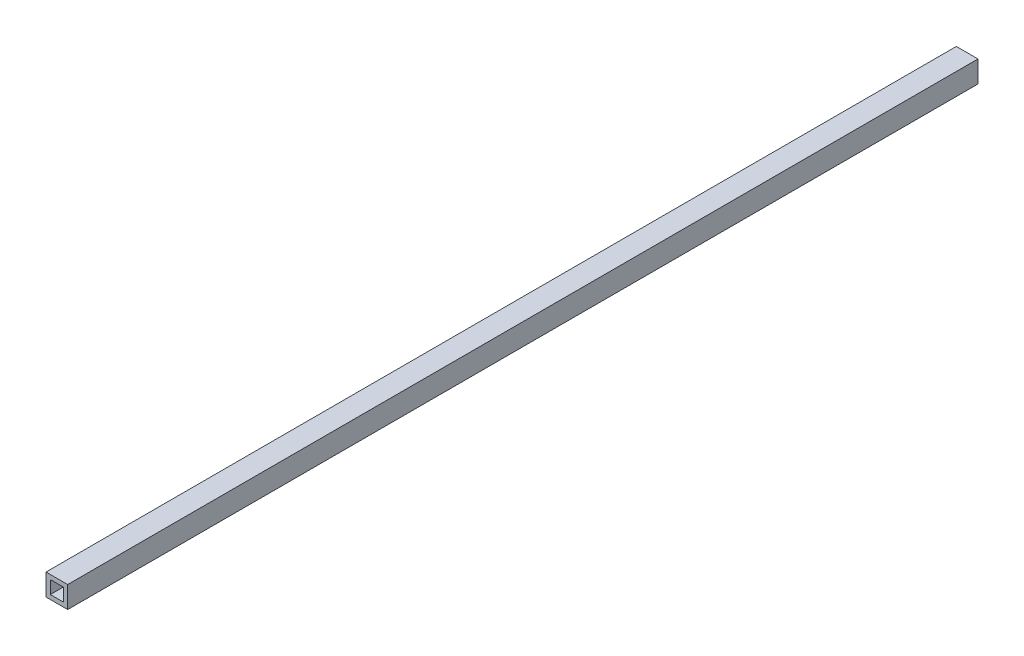
ISO-10303-21;
HEADER;
FILE_DESCRIPTION(('STEP AP214'),'2;1');
FILE_NAME('part.step','',(''),(''),'','','');
FILE_SCHEMA(('AUTOMOTIVE_DESIGN { 1 0 10303 214 1 1 1 1 }'));
ENDSEC;
DATA;
#1=APPLICATION_CONTEXT('core data for automotive mechanical design processes');
#2=APPLICATION_PROTOCOL_DEFINITION('international standard','automotive_design',2000,#1);
#3=PRODUCT_CONTEXT('',#1,'mechanical');
#4=PRODUCT('Part','Part','',(#3));
#5=PRODUCT_RELATED_PRODUCT_CATEGORY('part','',(#4));
#6=PRODUCT_DEFINITION_FORMATION('','',#4);
#7=PRODUCT_DEFINITION_CONTEXT('part definition',#1,'design');
#8=PRODUCT_DEFINITION('design','',#6,#7);
#9=PRODUCT_DEFINITION_SHAPE('','',#8);
#10=(LENGTH_UNIT() NAMED_UNIT(*) SI_UNIT(.MILLI.,.METRE.));
#11=(NAMED_UNIT(*) PLANE_ANGLE_UNIT() SI_UNIT($,.RADIAN.));
#12=(NAMED_UNIT(*) SI_UNIT($,.STERADIAN.) SOLID_ANGLE_UNIT());
#13=UNCERTAINTY_MEASURE_WITH_UNIT(LENGTH_MEASURE(1.E-05),#10,'distance_accuracy_value','');
#14=(GEOMETRIC_REPRESENTATION_CONTEXT(3) GLOBAL_UNCERTAINTY_ASSIGNED_CONTEXT((#13)) GLOBAL_UNIT_ASSIGNED_CONTEXT((#10,
#11,#12)) REPRESENTATION_CONTEXT('',''));
#15=CARTESIAN_POINT('',(0.,0.,0.));
#16=DIRECTION('',(0.,0.,1.));
#17=DIRECTION('',(1.,0.,0.));
#18=AXIS2_PLACEMENT_3D('',#15,#16,#17);
#19=CARTESIAN_POINT('',(50.,95.,2100.));
#20=DIRECTION('',(0.,0.,-1.));
#21=DIRECTION('',(-1.,0.,0.));
#22=AXIS2_PLACEMENT_3D('',#19,#20,#21);
#23=PLANE('',#22);
#24=DIRECTION('',(-1.,0.,0.));
#25=VECTOR('',#24,1.);
#26=CARTESIAN_POINT('',(-25.,25.,2100.));
#27=LINE('',#26,#25);
#28=CARTESIAN_POINT('',(25.,25.,2100.));
#29=VERTEX_POINT('',#28);
#30=CARTESIAN_POINT('',(-25.,25.,2100.));
#31=VERTEX_POINT('',#30);
#32=EDGE_CURVE('E12',#29,#31,#27,.T.);
#33=ORIENTED_EDGE('',*,*,#32,.T.);
#34=DIRECTION('',(0.,-1.,0.));
#35=VECTOR('',#34,1.);
#36=CARTESIAN_POINT('',(-25.,-25.,2100.));
#37=LINE('',#36,#35);
#38=CARTESIAN_POINT('',(-25.,-25.0000000000007,2100.));
#39=VERTEX_POINT('',#38);
#40=EDGE_CURVE('E61',#31,#39,#37,.T.);
#41=ORIENTED_EDGE('',*,*,#40,.T.);
#42=DIRECTION('',(-1.,0.,0.));
#43=VECTOR('',#42,1.);
#44=CARTESIAN_POINT('',(-25.,-25.,2100.));
#45=LINE('',#44,#43);
#46=CARTESIAN_POINT('',(25.,-25.0000000000007,2100.));
#47=VERTEX_POINT('',#46);
#48=EDGE_CURVE('E42',#47,#39,#45,.T.);
#49=ORIENTED_EDGE('',*,*,#48,.F.);
#50=DIRECTION('',(0.,1.,0.));
#51=VECTOR('',#50,1.);
#52=CARTESIAN_POINT('',(25.,-25.,2100.));
#53=LINE('',#52,#51);
#54=EDGE_CURVE('E47',#47,#29,#53,.T.);
#55=ORIENTED_EDGE('',*,*,#54,.T.);
#56=EDGE_LOOP('',(#33,#41,#49,#55));
#57=FACE_BOUND('',#56,.T.);
#58=DIRECTION('',(0.,-1.,0.));
#59=VECTOR('',#58,1.);
#60=CARTESIAN_POINT('',(-15.,-15.,2100.));
#61=LINE('',#60,#59);
#62=CARTESIAN_POINT('',(-15.,15.,2100.));
#63=VERTEX_POINT('',#62);
#64=CARTESIAN_POINT('',(-15.,-15.,2100.));
#65=VERTEX_POINT('',#64);
#66=EDGE_CURVE('E109',#63,#65,#61,.T.);
#67=ORIENTED_EDGE('',*,*,#66,.F.);
#68=DIRECTION('',(-1.,0.,0.));
#69=VECTOR('',#68,1.);
#70=CARTESIAN_POINT('',(-15.,15.,2100.));
#71=LINE('',#70,#69);
#72=CARTESIAN_POINT('',(15.,15.,2100.));
#73=VERTEX_POINT('',#72);
#74=EDGE_CURVE('E125',#73,#63,#71,.T.);
#75=ORIENTED_EDGE('',*,*,#74,.F.);
#76=DIRECTION('',(0.,1.,0.));
#77=VECTOR('',#76,1.);
#78=CARTESIAN_POINT('',(15.,-15.,2100.));
#79=LINE('',#78,#77);
#80=CARTESIAN_POINT('',(15.,-15.,2100.));
#81=VERTEX_POINT('',#80);
#82=EDGE_CURVE('E111',#81,#73,#79,.T.);
#83=ORIENTED_EDGE('',*,*,#82,.F.);
#84=DIRECTION('',(1.,0.,0.));
#85=VECTOR('',#84,1.);
#86=CARTESIAN_POINT('',(-15.,-15.,2100.));
#87=LINE('',#86,#85);
#88=EDGE_CURVE('E106',#65,#81,#87,.T.);
#89=ORIENTED_EDGE('',*,*,#88,.F.);
#90=EDGE_LOOP('',(#67,#75,#83,#89));
#91=FACE_BOUND('',#90,.T.);
#92=ADVANCED_FACE('F39',(#57,#91),#23,.F.);
#93=CARTESIAN_POINT('',(-15.,-15.,2100.));
#94=DIRECTION('',(1.,0.,0.));
#95=DIRECTION('',(0.,0.,-1.));
#96=AXIS2_PLACEMENT_3D('',#93,#94,#95);
#97=PLANE('',#96);
#98=DIRECTION('',(0.,-1.,0.));
#99=VECTOR('',#98,1.);
#100=CARTESIAN_POINT('',(-15.,-15.,0.));
#101=LINE('',#100,#99);
#102=CARTESIAN_POINT('',(-15.,15.,0.));
#103=VERTEX_POINT('',#102);
#104=CARTESIAN_POINT('',(-15.,-15.,0.));
#105=VERTEX_POINT('',#104);
#106=EDGE_CURVE('E136',#103,#105,#101,.T.);
#107=ORIENTED_EDGE('',*,*,#106,.F.);
#108=DIRECTION('',(0.,0.,-1.));
#109=VECTOR('',#108,1.);
#110=CARTESIAN_POINT('',(-15.,15.,2100.));
#111=LINE('',#110,#109);
#112=EDGE_CURVE('E124',#63,#103,#111,.T.);
#113=ORIENTED_EDGE('',*,*,#112,.F.);
#114=ORIENTED_EDGE('',*,*,#66,.T.);
#115=DIRECTION('',(0.,0.,-1.));
#116=VECTOR('',#115,1.);
#117=CARTESIAN_POINT('',(-15.,-15.,2100.));
#118=LINE('',#117,#116);
#119=EDGE_CURVE('E122',#65,#105,#118,.T.);
#120=ORIENTED_EDGE('',*,*,#119,.T.);
#121=EDGE_LOOP('',(#107,#113,#114,#120));
#122=FACE_BOUND('',#121,.T.);
#123=ADVANCED_FACE('F121',(#122),#97,.T.);
#124=CARTESIAN_POINT('',(-15.,15.,2100.));
#125=DIRECTION('',(0.,-1.,0.));
#126=DIRECTION('',(1.,0.,0.));
#127=AXIS2_PLACEMENT_3D('',#124,#125,#126);
#128=PLANE('',#127);
#129=DIRECTION('',(-1.,0.,0.));
#130=VECTOR('',#129,1.);
#131=CARTESIAN_POINT('',(-15.,15.,0.));
#132=LINE('',#131,#130);
#133=CARTESIAN_POINT('',(15.,15.,0.));
#134=VERTEX_POINT('',#133);
#135=EDGE_CURVE('E138',#134,#103,#132,.T.);
#136=ORIENTED_EDGE('',*,*,#135,.F.);
#137=DIRECTION('',(0.,0.,-1.));
#138=VECTOR('',#137,1.);
#139=CARTESIAN_POINT('',(15.,15.,2100.));
#140=LINE('',#139,#138);
#141=EDGE_CURVE('E132',#73,#134,#140,.T.);
#142=ORIENTED_EDGE('',*,*,#141,.F.);
#143=ORIENTED_EDGE('',*,*,#74,.T.);
#144=ORIENTED_EDGE('',*,*,#112,.T.);
#145=EDGE_LOOP('',(#136,#142,#143,#144));
#146=FACE_BOUND('',#145,.T.);
#147=ADVANCED_FACE('F180',(#146),#128,.T.);
#148=CARTESIAN_POINT('',(-15.,-15.,2100.));
#149=DIRECTION('',(0.,1.,0.));
#150=DIRECTION('',(0.,0.,1.));
#151=AXIS2_PLACEMENT_3D('',#148,#149,#150);
#152=PLANE('',#151);
#153=DIRECTION('',(1.,0.,0.));
#154=VECTOR('',#153,1.);
#155=CARTESIAN_POINT('',(-15.,-15.,0.));
#156=LINE('',#155,#154);
#157=CARTESIAN_POINT('',(15.,-15.,0.));
#158=VERTEX_POINT('',#157);
#159=EDGE_CURVE('E129',#105,#158,#156,.T.);
#160=ORIENTED_EDGE('',*,*,#159,.F.);
#161=ORIENTED_EDGE('',*,*,#119,.F.);
#162=ORIENTED_EDGE('',*,*,#88,.T.);
#163=DIRECTION('',(0.,0.,-1.));
#164=VECTOR('',#163,1.);
#165=CARTESIAN_POINT('',(15.,-15.,2100.));
#166=LINE('',#165,#164);
#167=EDGE_CURVE('E166',#81,#158,#166,.T.);
#168=ORIENTED_EDGE('',*,*,#167,.T.);
#169=EDGE_LOOP('',(#160,#161,#162,#168));
#170=FACE_BOUND('',#169,.T.);
#171=ADVANCED_FACE('F127',(#170),#152,.T.);
#172=CARTESIAN_POINT('',(-25.,-25.,2100.));
#173=DIRECTION('',(0.,1.,0.));
#174=DIRECTION('',(0.,0.,1.));
#175=AXIS2_PLACEMENT_3D('',#172,#173,#174);
#176=PLANE('',#175);
#177=DIRECTION('',(0.,0.,-1.));
#178=VECTOR('',#177,1.);
#179=CARTESIAN_POINT('',(25.,-25.,2100.));
#180=LINE('',#179,#178);
#181=CARTESIAN_POINT('',(25.,-25.0000000000007,0.));
#182=VERTEX_POINT('',#181);
#183=EDGE_CURVE('E153',#47,#182,#180,.T.);
#184=ORIENTED_EDGE('',*,*,#183,.F.);
#185=ORIENTED_EDGE('',*,*,#48,.T.);
#186=DIRECTION('',(0.,0.,-1.));
#187=VECTOR('',#186,1.);
#188=CARTESIAN_POINT('',(-25.,-25.,2100.));
#189=LINE('',#188,#187);
#190=CARTESIAN_POINT('',(-25.,-25.0000000000007,0.));
#191=VERTEX_POINT('',#190);
#192=EDGE_CURVE('E157',#39,#191,#189,.T.);
#193=ORIENTED_EDGE('',*,*,#192,.T.);
#194=DIRECTION('',(1.,0.,0.));
#195=VECTOR('',#194,1.);
#196=CARTESIAN_POINT('',(-25.,-25.,0.));
#197=LINE('',#196,#195);
#198=EDGE_CURVE('E116',#191,#182,#197,.T.);
#199=ORIENTED_EDGE('',*,*,#198,.T.);
#200=EDGE_LOOP('',(#184,#185,#193,#199));
#201=FACE_BOUND('',#200,.T.);
#202=ADVANCED_FACE('F155',(#201),#176,.F.);
#203=CARTESIAN_POINT('',(-25.,25.,0.));
#204=DIRECTION('',(0.,0.,1.));
#205=DIRECTION('',(1.,0.,0.));
#206=AXIS2_PLACEMENT_3D('',#203,#204,#205);
#207=PLANE('',#206);
#208=ORIENTED_EDGE('',*,*,#106,.T.);
#209=ORIENTED_EDGE('',*,*,#159,.T.);
#210=DIRECTION('',(0.,1.,0.));
#211=VECTOR('',#210,1.);
#212=CARTESIAN_POINT('',(15.,-15.,0.));
#213=LINE('',#212,#211);
#214=EDGE_CURVE('E140',#158,#134,#213,.T.);
#215=ORIENTED_EDGE('',*,*,#214,.T.);
#216=ORIENTED_EDGE('',*,*,#135,.T.);
#217=EDGE_LOOP('',(#208,#209,#215,#216));
#218=FACE_BOUND('',#217,.T.);
#219=DIRECTION('',(0.,-1.,0.));
#220=VECTOR('',#219,1.);
#221=CARTESIAN_POINT('',(-25.,-25.,0.));
#222=LINE('',#221,#220);
#223=CARTESIAN_POINT('',(-25.,25.,0.));
#224=VERTEX_POINT('',#223);
#225=EDGE_CURVE('E149',#224,#191,#222,.T.);
#226=ORIENTED_EDGE('',*,*,#225,.F.);
#227=DIRECTION('',(-1.,0.,0.));
#228=VECTOR('',#227,1.);
#229=CARTESIAN_POINT('',(-25.,25.,0.));
#230=LINE('',#229,#228);
#231=CARTESIAN_POINT('',(25.,25.,0.));
#232=VERTEX_POINT('',#231);
#233=EDGE_CURVE('E152',#232,#224,#230,.T.);
#234=ORIENTED_EDGE('',*,*,#233,.F.);
#235=DIRECTION('',(0.,1.,0.));
#236=VECTOR('',#235,1.);
#237=CARTESIAN_POINT('',(25.,-25.,0.));
#238=LINE('',#237,#236);
#239=EDGE_CURVE('E161',#182,#232,#238,.T.);
#240=ORIENTED_EDGE('',*,*,#239,.F.);
#241=ORIENTED_EDGE('',*,*,#198,.F.);
#242=EDGE_LOOP('',(#226,#234,#240,#241));
#243=FACE_BOUND('',#242,.T.);
#244=ADVANCED_FACE('F162',(#218,#243),#207,.F.);
#245=CARTESIAN_POINT('',(25.,-25.,2100.));
#246=DIRECTION('',(-1.,0.,0.));
#247=DIRECTION('',(0.,0.,1.));
#248=AXIS2_PLACEMENT_3D('',#245,#246,#247);
#249=PLANE('',#248);
#250=ORIENTED_EDGE('',*,*,#239,.T.);
#251=DIRECTION('',(0.,0.,-1.));
#252=VECTOR('',#251,1.);
#253=CARTESIAN_POINT('',(25.,25.,2100.));
#254=LINE('',#253,#252);
#255=EDGE_CURVE('E148',#29,#232,#254,.T.);
#256=ORIENTED_EDGE('',*,*,#255,.F.);
#257=ORIENTED_EDGE('',*,*,#54,.F.);
#258=ORIENTED_EDGE('',*,*,#183,.T.);
#259=EDGE_LOOP('',(#250,#256,#257,#258));
#260=FACE_BOUND('',#259,.T.);
#261=ADVANCED_FACE('F168',(#260),#249,.F.);
#262=CARTESIAN_POINT('',(-25.,25.,1950.));
#263=DIRECTION('',(-1.,0.,0.));
#264=DIRECTION('',(0.,0.,1.));
#265=AXIS2_PLACEMENT_3D('',#262,#263,#264);
#266=PLANE('',#265);
#267=DIRECTION('',(0.,0.,-1.));
#268=VECTOR('',#267,1.);
#269=CARTESIAN_POINT('',(-25.,25.,2100.));
#270=LINE('',#269,#268);
#271=EDGE_CURVE('E146',#31,#224,#270,.T.);
#272=ORIENTED_EDGE('',*,*,#271,.T.);
#273=ORIENTED_EDGE('',*,*,#225,.T.);
#274=ORIENTED_EDGE('',*,*,#192,.F.);
#275=ORIENTED_EDGE('',*,*,#40,.F.);
#276=EDGE_LOOP('',(#272,#273,#274,#275));
#277=FACE_BOUND('',#276,.T.);
#278=ADVANCED_FACE('F187',(#277),#266,.T.);
#279=CARTESIAN_POINT('',(-25.,25.,2100.));
#280=DIRECTION('',(0.,-1.,0.));
#281=DIRECTION('',(0.,0.,-1.));
#282=AXIS2_PLACEMENT_3D('',#279,#280,#281);
#283=PLANE('',#282);
#284=ORIENTED_EDGE('',*,*,#271,.F.);
#285=ORIENTED_EDGE('',*,*,#32,.F.);
#286=ORIENTED_EDGE('',*,*,#255,.T.);
#287=ORIENTED_EDGE('',*,*,#233,.T.);
#288=EDGE_LOOP('',(#284,#285,#286,#287));
#289=FACE_BOUND('',#288,.T.);
#290=ADVANCED_FACE('F197',(#289),#283,.F.);
#291=CARTESIAN_POINT('',(15.,-15.,2100.));
#292=DIRECTION('',(-1.,0.,0.));
#293=DIRECTION('',(0.,-1.,0.));
#294=AXIS2_PLACEMENT_3D('',#291,#292,#293);
#295=PLANE('',#294);
#296=ORIENTED_EDGE('',*,*,#214,.F.);
#297=ORIENTED_EDGE('',*,*,#167,.F.);
#298=ORIENTED_EDGE('',*,*,#82,.T.);
#299=ORIENTED_EDGE('',*,*,#141,.T.);
#300=EDGE_LOOP('',(#296,#297,#298,#299));
#301=FACE_BOUND('',#300,.T.);
#302=ADVANCED_FACE('F178',(#301),#295,.T.);
#303=CLOSED_SHELL('',(#92,#123,#147,#171,#202,#244,#261,#278,#290,#302));
#304=MANIFOLD_SOLID_BREP('B2',#303);
#305=ADVANCED_BREP_SHAPE_REPRESENTATION('',(#18,#304),#14);
#306=SHAPE_DEFINITION_REPRESENTATION(#9,#305);
ENDSEC;
END-ISO-10303-21;
